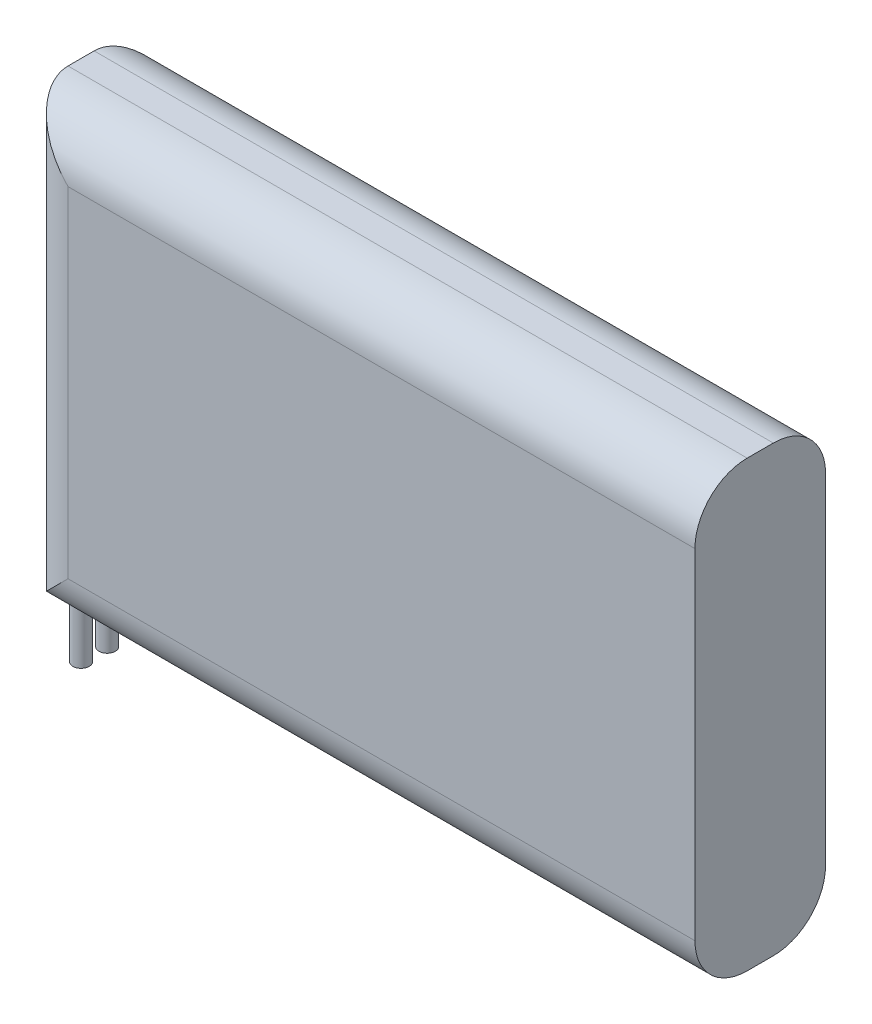
ISO-10303-21;
HEADER;
FILE_DESCRIPTION(('STEP AP214'),'2;1');
FILE_NAME('part.step','',(''),(''),'','','');
FILE_SCHEMA(('AUTOMOTIVE_DESIGN { 1 0 10303 214 1 1 1 1 }'));
ENDSEC;
DATA;
#1=APPLICATION_CONTEXT('core data for automotive mechanical design processes');
#2=APPLICATION_PROTOCOL_DEFINITION('international standard','automotive_design',2000,#1);
#3=PRODUCT_CONTEXT('',#1,'mechanical');
#4=PRODUCT('Part','Part','',(#3));
#5=PRODUCT_RELATED_PRODUCT_CATEGORY('part','',(#4));
#6=PRODUCT_DEFINITION_FORMATION('','',#4);
#7=PRODUCT_DEFINITION_CONTEXT('part definition',#1,'design');
#8=PRODUCT_DEFINITION('design','',#6,#7);
#9=PRODUCT_DEFINITION_SHAPE('','',#8);
#10=(LENGTH_UNIT() NAMED_UNIT(*) SI_UNIT(.MILLI.,.METRE.));
#11=(NAMED_UNIT(*) PLANE_ANGLE_UNIT() SI_UNIT($,.RADIAN.));
#12=(NAMED_UNIT(*) SI_UNIT($,.STERADIAN.) SOLID_ANGLE_UNIT());
#13=UNCERTAINTY_MEASURE_WITH_UNIT(LENGTH_MEASURE(1.E-05),#10,'distance_accuracy_value','');
#14=(GEOMETRIC_REPRESENTATION_CONTEXT(3) GLOBAL_UNCERTAINTY_ASSIGNED_CONTEXT((#13)) GLOBAL_UNIT_ASSIGNED_CONTEXT((#10,
#11,#12)) REPRESENTATION_CONTEXT('',''));
#15=CARTESIAN_POINT('',(0.,0.,0.));
#16=DIRECTION('',(0.,0.,1.));
#17=DIRECTION('',(1.,0.,0.));
#18=AXIS2_PLACEMENT_3D('',#15,#16,#17);
#19=CARTESIAN_POINT('',(26.,-17.,5.));
#20=DIRECTION('',(-1.,0.,0.));
#21=DIRECTION('',(0.,0.,1.));
#22=AXIS2_PLACEMENT_3D('',#19,#20,#21);
#23=PLANE('',#22);
#24=DIRECTION('',(0.,0.,-1.));
#25=VECTOR('',#24,1.);
#26=CARTESIAN_POINT('',(26.,-17.,5.));
#27=LINE('',#26,#25);
#28=CARTESIAN_POINT('',(26.,-17.,1.));
#29=VERTEX_POINT('',#28);
#30=CARTESIAN_POINT('',(26.,-17.,-1.));
#31=VERTEX_POINT('',#30);
#32=EDGE_CURVE('E152',#29,#31,#27,.T.);
#33=ORIENTED_EDGE('',*,*,#32,.T.);
#34=CARTESIAN_POINT('',(26.,-13.,-1.));
#35=DIRECTION('',(-1.,0.,0.));
#36=DIRECTION('',(0.,0.,1.));
#37=AXIS2_PLACEMENT_3D('',#34,#35,#36);
#38=CIRCLE('',#37,4.);
#39=CARTESIAN_POINT('',(26.,-13.,-5.));
#40=VERTEX_POINT('',#39);
#41=EDGE_CURVE('E160',#31,#40,#38,.F.);
#42=ORIENTED_EDGE('',*,*,#41,.T.);
#43=DIRECTION('',(0.,1.,0.));
#44=VECTOR('',#43,1.);
#45=CARTESIAN_POINT('',(26.,-17.,-5.));
#46=LINE('',#45,#44);
#47=CARTESIAN_POINT('',(26.,13.,-5.));
#48=VERTEX_POINT('',#47);
#49=EDGE_CURVE('E153',#40,#48,#46,.T.);
#50=ORIENTED_EDGE('',*,*,#49,.T.);
#51=CARTESIAN_POINT('',(26.,13.,-1.));
#52=DIRECTION('',(-1.,0.,0.));
#53=DIRECTION('',(0.,0.,1.));
#54=AXIS2_PLACEMENT_3D('',#51,#52,#53);
#55=CIRCLE('',#54,4.);
#56=CARTESIAN_POINT('',(26.,17.,-1.));
#57=VERTEX_POINT('',#56);
#58=EDGE_CURVE('E69',#48,#57,#55,.F.);
#59=ORIENTED_EDGE('',*,*,#58,.T.);
#60=DIRECTION('',(0.,0.,-1.));
#61=VECTOR('',#60,1.);
#62=CARTESIAN_POINT('',(26.,17.,5.));
#63=LINE('',#62,#61);
#64=CARTESIAN_POINT('',(26.,17.,1.));
#65=VERTEX_POINT('',#64);
#66=EDGE_CURVE('E265',#65,#57,#63,.T.);
#67=ORIENTED_EDGE('',*,*,#66,.F.);
#68=CARTESIAN_POINT('',(26.,13.,1.));
#69=DIRECTION('',(-1.,0.,0.));
#70=DIRECTION('',(0.,0.,1.));
#71=AXIS2_PLACEMENT_3D('',#68,#69,#70);
#72=CIRCLE('',#71,4.);
#73=CARTESIAN_POINT('',(26.,13.,5.));
#74=VERTEX_POINT('',#73);
#75=EDGE_CURVE('E150',#65,#74,#72,.F.);
#76=ORIENTED_EDGE('',*,*,#75,.T.);
#77=DIRECTION('',(0.,1.,0.));
#78=VECTOR('',#77,1.);
#79=CARTESIAN_POINT('',(26.,-17.,5.));
#80=LINE('',#79,#78);
#81=CARTESIAN_POINT('',(26.,-13.,5.));
#82=VERTEX_POINT('',#81);
#83=EDGE_CURVE('E136',#82,#74,#80,.T.);
#84=ORIENTED_EDGE('',*,*,#83,.F.);
#85=CARTESIAN_POINT('',(26.,-13.,1.));
#86=DIRECTION('',(-1.,0.,0.));
#87=DIRECTION('',(0.,0.,1.));
#88=AXIS2_PLACEMENT_3D('',#85,#86,#87);
#89=CIRCLE('',#88,4.);
#90=EDGE_CURVE('E147',#82,#29,#89,.F.);
#91=ORIENTED_EDGE('',*,*,#90,.T.);
#92=EDGE_LOOP('',(#33,#42,#50,#59,#67,#76,#84,#91));
#93=FACE_BOUND('',#92,.T.);
#94=ADVANCED_FACE('F51',(#93),#23,.F.);
#95=CARTESIAN_POINT('',(-26.,17.,5.));
#96=DIRECTION('',(0.,-1.,0.));
#97=DIRECTION('',(0.,0.,-1.));
#98=AXIS2_PLACEMENT_3D('',#95,#96,#97);
#99=PLANE('',#98);
#100=ORIENTED_EDGE('',*,*,#66,.T.);
#101=DIRECTION('',(-1.,0.,0.));
#102=VECTOR('',#101,1.);
#103=CARTESIAN_POINT('',(-26.,17.,-1.));
#104=LINE('',#103,#102);
#105=CARTESIAN_POINT('',(-26.,17.,-1.));
#106=VERTEX_POINT('',#105);
#107=EDGE_CURVE('E170',#57,#106,#104,.T.);
#108=ORIENTED_EDGE('',*,*,#107,.T.);
#109=DIRECTION('',(0.,0.,-1.));
#110=VECTOR('',#109,1.);
#111=CARTESIAN_POINT('',(-26.,17.,5.));
#112=LINE('',#111,#110);
#113=CARTESIAN_POINT('',(-26.,17.,1.));
#114=VERTEX_POINT('',#113);
#115=EDGE_CURVE('E261',#114,#106,#112,.T.);
#116=ORIENTED_EDGE('',*,*,#115,.F.);
#117=DIRECTION('',(-1.,0.,0.));
#118=VECTOR('',#117,1.);
#119=CARTESIAN_POINT('',(-26.,17.,1.));
#120=LINE('',#119,#118);
#121=EDGE_CURVE('E76',#114,#65,#120,.F.);
#122=ORIENTED_EDGE('',*,*,#121,.T.);
#123=EDGE_LOOP('',(#100,#108,#116,#122));
#124=FACE_BOUND('',#123,.T.);
#125=ADVANCED_FACE('F211',(#124),#99,.F.);
#126=CARTESIAN_POINT('',(-26.,-17.,5.));
#127=DIRECTION('',(1.,0.,0.));
#128=DIRECTION('',(0.,0.,-1.));
#129=AXIS2_PLACEMENT_3D('',#126,#127,#128);
#130=PLANE('',#129);
#131=DIRECTION('',(0.,0.,-1.));
#132=VECTOR('',#131,1.);
#133=CARTESIAN_POINT('',(-26.,-17.,5.));
#134=LINE('',#133,#132);
#135=CARTESIAN_POINT('',(-26.,-17.,1.));
#136=VERTEX_POINT('',#135);
#137=CARTESIAN_POINT('',(-26.,-17.,-1.));
#138=VERTEX_POINT('',#137);
#139=EDGE_CURVE('E257',#136,#138,#134,.T.);
#140=ORIENTED_EDGE('',*,*,#139,.F.);
#141=DIRECTION('',(0.,-1.,0.));
#142=VECTOR('',#141,1.);
#143=CARTESIAN_POINT('',(-26.,-17.,1.));
#144=LINE('',#143,#142);
#145=EDGE_CURVE('E284',#136,#114,#144,.F.);
#146=ORIENTED_EDGE('',*,*,#145,.T.);
#147=ORIENTED_EDGE('',*,*,#115,.T.);
#148=DIRECTION('',(0.,-1.,0.));
#149=VECTOR('',#148,1.);
#150=CARTESIAN_POINT('',(-26.,-17.,-1.));
#151=LINE('',#150,#149);
#152=EDGE_CURVE('E144',#106,#138,#151,.T.);
#153=ORIENTED_EDGE('',*,*,#152,.T.);
#154=EDGE_LOOP('',(#140,#146,#147,#153));
#155=FACE_BOUND('',#154,.T.);
#156=ADVANCED_FACE('F214',(#155),#130,.F.);
#157=CARTESIAN_POINT('',(-26.,-17.,5.));
#158=DIRECTION('',(0.,1.,0.));
#159=DIRECTION('',(0.,0.,1.));
#160=AXIS2_PLACEMENT_3D('',#157,#158,#159);
#161=PLANE('',#160);
#162=ORIENTED_EDGE('',*,*,#139,.T.);
#163=DIRECTION('',(1.,0.,0.));
#164=VECTOR('',#163,1.);
#165=CARTESIAN_POINT('',(26.,-17.,-1.));
#166=LINE('',#165,#164);
#167=CARTESIAN_POINT('',(-25.625,-17.,-1.));
#168=VERTEX_POINT('',#167);
#169=EDGE_CURVE('E304',#138,#168,#166,.T.);
#170=ORIENTED_EDGE('',*,*,#169,.T.);
#171=CARTESIAN_POINT('',(-25.,-17.,-1.));
#172=DIRECTION('',(0.,1.,0.));
#173=DIRECTION('',(0.,0.,1.));
#174=AXIS2_PLACEMENT_3D('',#171,#172,#173);
#175=CIRCLE('',#174,0.624999999999999);
#176=CARTESIAN_POINT('',(-24.375,-17.,-1.));
#177=VERTEX_POINT('',#176);
#178=EDGE_CURVE('E268',#177,#168,#175,.F.);
#179=ORIENTED_EDGE('',*,*,#178,.F.);
#180=DIRECTION('',(1.,0.,0.));
#181=VECTOR('',#180,1.);
#182=CARTESIAN_POINT('',(26.,-17.,-1.));
#183=LINE('',#182,#181);
#184=EDGE_CURVE('E301',#177,#31,#183,.T.);
#185=ORIENTED_EDGE('',*,*,#184,.T.);
#186=ORIENTED_EDGE('',*,*,#32,.F.);
#187=DIRECTION('',(1.,0.,0.));
#188=VECTOR('',#187,1.);
#189=CARTESIAN_POINT('',(-26.,-17.,1.));
#190=LINE('',#189,#188);
#191=CARTESIAN_POINT('',(-24.375,-17.,1.));
#192=VERTEX_POINT('',#191);
#193=EDGE_CURVE('E158',#29,#192,#190,.F.);
#194=ORIENTED_EDGE('',*,*,#193,.T.);
#195=CARTESIAN_POINT('',(-25.,-17.,1.));
#196=DIRECTION('',(0.,1.,0.));
#197=DIRECTION('',(0.,0.,1.));
#198=AXIS2_PLACEMENT_3D('',#195,#196,#197);
#199=CIRCLE('',#198,0.624999999999999);
#200=CARTESIAN_POINT('',(-25.625,-17.,1.));
#201=VERTEX_POINT('',#200);
#202=EDGE_CURVE('E272',#201,#192,#199,.F.);
#203=ORIENTED_EDGE('',*,*,#202,.F.);
#204=DIRECTION('',(1.,0.,0.));
#205=VECTOR('',#204,1.);
#206=CARTESIAN_POINT('',(-26.,-17.,1.));
#207=LINE('',#206,#205);
#208=EDGE_CURVE('E296',#201,#136,#207,.F.);
#209=ORIENTED_EDGE('',*,*,#208,.T.);
#210=EDGE_LOOP('',(#162,#170,#179,#185,#186,#194,#203,#209));
#211=FACE_BOUND('',#210,.T.);
#212=ADVANCED_FACE('F217',(#211),#161,.F.);
#213=CARTESIAN_POINT('',(0.,0.,5.));
#214=DIRECTION('',(0.,0.,-1.));
#215=DIRECTION('',(-1.,0.,0.));
#216=AXIS2_PLACEMENT_3D('',#213,#214,#215);
#217=PLANE('',#216);
#218=DIRECTION('',(0.,-1.,0.));
#219=VECTOR('',#218,1.);
#220=CARTESIAN_POINT('',(-22.,0.,5.));
#221=LINE('',#220,#219);
#222=CARTESIAN_POINT('',(-22.,13.,5.));
#223=VERTEX_POINT('',#222);
#224=CARTESIAN_POINT('',(-22.,-13.,5.));
#225=VERTEX_POINT('',#224);
#226=EDGE_CURVE('E139',#223,#225,#221,.T.);
#227=ORIENTED_EDGE('',*,*,#226,.T.);
#228=DIRECTION('',(1.,0.,0.));
#229=VECTOR('',#228,1.);
#230=CARTESIAN_POINT('',(0.,-13.,5.));
#231=LINE('',#230,#229);
#232=EDGE_CURVE('E133',#225,#82,#231,.T.);
#233=ORIENTED_EDGE('',*,*,#232,.T.);
#234=ORIENTED_EDGE('',*,*,#83,.T.);
#235=DIRECTION('',(-1.,0.,0.));
#236=VECTOR('',#235,1.);
#237=CARTESIAN_POINT('',(0.,13.,5.));
#238=LINE('',#237,#236);
#239=EDGE_CURVE('E276',#74,#223,#238,.T.);
#240=ORIENTED_EDGE('',*,*,#239,.T.);
#241=EDGE_LOOP('',(#227,#233,#234,#240));
#242=FACE_BOUND('',#241,.T.);
#243=ADVANCED_FACE('F135',(#242),#217,.F.);
#244=CARTESIAN_POINT('',(0.,0.,-5.));
#245=DIRECTION('',(0.,0.,-1.));
#246=DIRECTION('',(-1.,0.,0.));
#247=AXIS2_PLACEMENT_3D('',#244,#245,#246);
#248=PLANE('',#247);
#249=ORIENTED_EDGE('',*,*,#49,.F.);
#250=DIRECTION('',(1.,0.,0.));
#251=VECTOR('',#250,1.);
#252=CARTESIAN_POINT('',(-26.,-13.,-5.));
#253=LINE('',#252,#251);
#254=CARTESIAN_POINT('',(-22.,-13.,-5.));
#255=VERTEX_POINT('',#254);
#256=EDGE_CURVE('E293',#40,#255,#253,.F.);
#257=ORIENTED_EDGE('',*,*,#256,.T.);
#258=DIRECTION('',(0.,-1.,0.));
#259=VECTOR('',#258,1.);
#260=CARTESIAN_POINT('',(-22.,17.,-5.));
#261=LINE('',#260,#259);
#262=CARTESIAN_POINT('',(-22.,13.,-5.));
#263=VERTEX_POINT('',#262);
#264=EDGE_CURVE('E290',#255,#263,#261,.F.);
#265=ORIENTED_EDGE('',*,*,#264,.T.);
#266=DIRECTION('',(-1.,0.,0.));
#267=VECTOR('',#266,1.);
#268=CARTESIAN_POINT('',(26.,13.,-5.));
#269=LINE('',#268,#267);
#270=EDGE_CURVE('E287',#263,#48,#269,.F.);
#271=ORIENTED_EDGE('',*,*,#270,.T.);
#272=EDGE_LOOP('',(#249,#257,#265,#271));
#273=FACE_BOUND('',#272,.T.);
#274=ADVANCED_FACE('F222',(#273),#248,.T.);
#275=CARTESIAN_POINT('',(-25.,-22.,-1.));
#276=DIRECTION('',(0.,1.,0.));
#277=DIRECTION('',(0.,0.,1.));
#278=AXIS2_PLACEMENT_3D('',#275,#276,#277);
#279=CYLINDRICAL_SURFACE('',#278,0.624999999999999);
#280=CARTESIAN_POINT('',(-25.,-22.,-1.));
#281=DIRECTION('',(0.,-1.,0.));
#282=DIRECTION('',(0.,0.,-1.));
#283=AXIS2_PLACEMENT_3D('',#280,#281,#282);
#284=CIRCLE('',#283,0.624999999999999);
#285=CARTESIAN_POINT('',(-25.,-22.,-1.625));
#286=VERTEX_POINT('',#285);
#287=EDGE_CURVE('E240',#286,#286,#284,.T.);
#288=ORIENTED_EDGE('',*,*,#287,.F.);
#289=EDGE_LOOP('',(#288));
#290=FACE_BOUND('',#289,.T.);
#291=ORIENTED_EDGE('',*,*,#178,.T.);
#292=CARTESIAN_POINT('',(-25.625,-17.,-1.));
#293=CARTESIAN_POINT('',(-25.6250308655019,-17.000017368962,-1.0349363219005));
#294=CARTESIAN_POINT('',(-25.6220726469361,-16.9995428082822,-1.06985904974601));
#295=CARTESIAN_POINT('',(-25.6104113976975,-16.9977390417988,-1.13866698580614));
#296=CARTESIAN_POINT('',(-25.601715435193,-16.9964108875659,-1.17255341693393));
#297=CARTESIAN_POINT('',(-25.5788080515548,-16.9930281232149,-1.23837759775431));
#298=CARTESIAN_POINT('',(-25.5645952062425,-16.9909733255268,-1.27031484180027));
#299=CARTESIAN_POINT('',(-25.5310769147095,-16.9863694276969,-1.33135167996408));
#300=CARTESIAN_POINT('',(-25.5117715580788,-16.9838203362512,-1.36045132399007));
#301=CARTESIAN_POINT('',(-25.4684429677998,-16.9784858949165,-1.41522873433129));
#302=CARTESIAN_POINT('',(-25.4443856515681,-16.9756989261191,-1.44087938742411));
#303=CARTESIAN_POINT('',(-25.3923072094823,-16.9702154293288,-1.48779981245885));
#304=CARTESIAN_POINT('',(-25.3642854618611,-16.9675189156048,-1.5090688959235));
#305=CARTESIAN_POINT('',(-25.3048895793674,-16.9625060041086,-1.54672691673645));
#306=CARTESIAN_POINT('',(-25.2734983101829,-16.9601917172841,-1.56308913470013));
#307=CARTESIAN_POINT('',(-25.2083726874103,-16.9562279065361,-1.59029733207087));
#308=CARTESIAN_POINT('',(-25.1746386084534,-16.9545783048499,-1.60114395679597));
#309=CARTESIAN_POINT('',(-25.1060726863408,-16.9521466013685,-1.61692880411778));
#310=CARTESIAN_POINT('',(-25.0712519402121,-16.9513575852256,-1.62191414468571));
#311=CARTESIAN_POINT('',(-25.0012590466262,-16.9507154242014,-1.62598094577583));
#312=CARTESIAN_POINT('',(-24.9660869126879,-16.9508622434529,-1.62506263256398));
#313=CARTESIAN_POINT('',(-24.8967256357049,-16.952068877991,-1.61738644104511));
#314=CARTESIAN_POINT('',(-24.8625304842358,-16.9531204369934,-1.61068136862377));
#315=CARTESIAN_POINT('',(-24.7957567987818,-16.956005152012,-1.59170476696579));
#316=CARTESIAN_POINT('',(-24.7631783042175,-16.9578383270766,-1.57943310206709));
#317=CARTESIAN_POINT('',(-24.700402214455,-16.9620888084257,-1.54961701316045));
#318=CARTESIAN_POINT('',(-24.6702153855657,-16.9645085767808,-1.53205028681463));
#319=CARTESIAN_POINT('',(-24.6131990733347,-16.9696577208892,-1.49215924365022));
#320=CARTESIAN_POINT('',(-24.5863696992215,-16.9723871067097,-1.46983477211111));
#321=CARTESIAN_POINT('',(-24.5365259634274,-16.9778840786314,-1.42077632218555));
#322=CARTESIAN_POINT('',(-24.5135556912793,-16.980651760075,-1.39399754144435));
#323=CARTESIAN_POINT('',(-24.4724218099053,-16.985887113694,-1.33693225804762));
#324=CARTESIAN_POINT('',(-24.454259575235,-16.9883546999673,-1.30664475584424));
#325=CARTESIAN_POINT('',(-24.4232544957904,-16.9927150690655,-1.24337828299203));
#326=CARTESIAN_POINT('',(-24.4104183363078,-16.9946071286991,-1.21039599158943));
#327=CARTESIAN_POINT('',(-24.3904980141408,-16.9975954216003,-1.14273063024009));
#328=CARTESIAN_POINT('',(-24.3834052620537,-16.9986928430072,-1.10805018261246));
#329=CARTESIAN_POINT('',(-24.3778559021813,-16.9995546431177,-1.06092493514729));
#330=CARTESIAN_POINT('',(-24.3767844709786,-16.9997215219004,-1.04875438227657));
#331=CARTESIAN_POINT('',(-24.3753574609305,-16.999944081025,-1.0243909783464));
#332=CARTESIAN_POINT('',(-24.3750006761069,-16.9999999486987,-1.01219819966422));
#333=CARTESIAN_POINT('',(-24.375,-17.,-1.));
#334=B_SPLINE_CURVE_WITH_KNOTS('',3,(#292,#293,#294,#295,#296,#297,#298,#299,#300,#301,#302,
#303,#304,#305,#306,#307,#308,#309,#310,#311,#312,#313,#314,#315,#316,#317,#318,#319,#320,#321,
#322,#323,#324,#325,#326,#327,#328,#329,#330,#331,#332,#333),.UNSPECIFIED.,.F.,.F.,(4,2,2,2,2,2,
2,2,2,2,2,2,2,2,2,2,2,2,2,2,4),(0.,0.104660423346731,0.209192158517028,0.313750896432518,
0.418307795021119,0.523643781636771,0.628996307122004,0.734912506334447,0.840816310620932,
0.94586281946011,1.05090530226603,1.15499925624547,1.25909574720932,1.36363695990815,
1.46818157277613,1.5738495088923,1.6795476215544,1.78537800808539,1.89104982891409,
1.92769014262603,1.96426857290777),.UNSPECIFIED.);
#335=EDGE_CURVE('E61',#168,#177,#334,.T.);
#336=ORIENTED_EDGE('',*,*,#335,.T.);
#337=EDGE_LOOP('',(#291,#336));
#338=FACE_BOUND('',#337,.T.);
#339=ADVANCED_FACE('F186',(#290,#338),#279,.T.);
#340=CARTESIAN_POINT('',(-25.,-22.,-1.));
#341=DIRECTION('',(0.,-1.,0.));
#342=DIRECTION('',(0.,0.,-1.));
#343=AXIS2_PLACEMENT_3D('',#340,#341,#342);
#344=PLANE('',#343);
#345=ORIENTED_EDGE('',*,*,#287,.T.);
#346=EDGE_LOOP('',(#345));
#347=FACE_BOUND('',#346,.T.);
#348=ADVANCED_FACE('F227',(#347),#344,.T.);
#349=CARTESIAN_POINT('',(-25.,-22.,1.));
#350=DIRECTION('',(0.,1.,0.));
#351=DIRECTION('',(0.,0.,1.));
#352=AXIS2_PLACEMENT_3D('',#349,#350,#351);
#353=CYLINDRICAL_SURFACE('',#352,0.624999999999999);
#354=CARTESIAN_POINT('',(-25.,-22.,1.));
#355=DIRECTION('',(0.,-1.,0.));
#356=DIRECTION('',(0.,0.,-1.));
#357=AXIS2_PLACEMENT_3D('',#354,#355,#356);
#358=CIRCLE('',#357,0.624999999999999);
#359=CARTESIAN_POINT('',(-25.,-22.,0.375000000000001));
#360=VERTEX_POINT('',#359);
#361=EDGE_CURVE('E242',#360,#360,#358,.T.);
#362=ORIENTED_EDGE('',*,*,#361,.F.);
#363=EDGE_LOOP('',(#362));
#364=FACE_BOUND('',#363,.T.);
#365=ORIENTED_EDGE('',*,*,#202,.T.);
#366=CARTESIAN_POINT('',(-24.375,-17.,1.));
#367=CARTESIAN_POINT('',(-24.3749691344981,-17.000017368962,1.0349363219005));
#368=CARTESIAN_POINT('',(-24.3779273530639,-16.9995428082822,1.06985904974601));
#369=CARTESIAN_POINT('',(-24.3895886023025,-16.9977390417988,1.13866698580614));
#370=CARTESIAN_POINT('',(-24.398284564807,-16.9964108875659,1.17255341693393));
#371=CARTESIAN_POINT('',(-24.4211919484451,-16.9930281232149,1.23837759775431));
#372=CARTESIAN_POINT('',(-24.4354047937575,-16.9909733255268,1.27031484180027));
#373=CARTESIAN_POINT('',(-24.4689230852905,-16.9863694276969,1.33135167996407));
#374=CARTESIAN_POINT('',(-24.4882284419212,-16.9838203362512,1.36045132399007));
#375=CARTESIAN_POINT('',(-24.5315570322002,-16.9784858949165,1.41522873433129));
#376=CARTESIAN_POINT('',(-24.5556143484319,-16.9756989261191,1.44087938742411));
#377=CARTESIAN_POINT('',(-24.6076927905176,-16.9702154293288,1.48779981245885));
#378=CARTESIAN_POINT('',(-24.6357145381389,-16.9675189156048,1.5090688959235));
#379=CARTESIAN_POINT('',(-24.6951104206326,-16.9625060041086,1.54672691673645));
#380=CARTESIAN_POINT('',(-24.7265016898171,-16.9601917172841,1.56308913470013));
#381=CARTESIAN_POINT('',(-24.7916273125897,-16.9562279065361,1.59029733207087));
#382=CARTESIAN_POINT('',(-24.8253613915466,-16.9545783048499,1.60114395679597));
#383=CARTESIAN_POINT('',(-24.8939273136592,-16.9521466013685,1.61692880411778));
#384=CARTESIAN_POINT('',(-24.9287480597878,-16.9513575852256,1.62191414468571));
#385=CARTESIAN_POINT('',(-24.9987409533738,-16.9507154242014,1.62598094577583));
#386=CARTESIAN_POINT('',(-25.0339130873121,-16.9508622434529,1.62506263256398));
#387=CARTESIAN_POINT('',(-25.1032743642951,-16.952068877991,1.61738644104511));
#388=CARTESIAN_POINT('',(-25.1374695157642,-16.9531204369934,1.61068136862377));
#389=CARTESIAN_POINT('',(-25.2042432012182,-16.956005152012,1.59170476696579));
#390=CARTESIAN_POINT('',(-25.2368216957824,-16.9578383270766,1.57943310206709));
#391=CARTESIAN_POINT('',(-25.299597785545,-16.9620888084257,1.54961701316045));
#392=CARTESIAN_POINT('',(-25.3297846144343,-16.9645085767808,1.53205028681463));
#393=CARTESIAN_POINT('',(-25.3868009266653,-16.9696577208892,1.49215924365022));
#394=CARTESIAN_POINT('',(-25.4136303007785,-16.9723871067097,1.46983477211111));
#395=CARTESIAN_POINT('',(-25.4634740365725,-16.9778840786314,1.42077632218555));
#396=CARTESIAN_POINT('',(-25.4864443087207,-16.980651760075,1.39399754144435));
#397=CARTESIAN_POINT('',(-25.5275781900947,-16.985887113694,1.33693225804762));
#398=CARTESIAN_POINT('',(-25.545740424765,-16.9883546999673,1.30664475584424));
#399=CARTESIAN_POINT('',(-25.5767455042096,-16.9927150690655,1.24337828299203));
#400=CARTESIAN_POINT('',(-25.5895816636922,-16.9946071286991,1.21039599158943));
#401=CARTESIAN_POINT('',(-25.6095019858592,-16.9975954216003,1.14273063024009));
#402=CARTESIAN_POINT('',(-25.6165947379463,-16.9986928430072,1.10805018261246));
#403=CARTESIAN_POINT('',(-25.6221440978187,-16.9995546431177,1.06092493514729));
#404=CARTESIAN_POINT('',(-25.6232155290214,-16.9997215219004,1.04875438227657));
#405=CARTESIAN_POINT('',(-25.6246425390695,-16.999944081025,1.0243909783464));
#406=CARTESIAN_POINT('',(-25.624999323893,-16.9999999486987,1.01219819966422));
#407=CARTESIAN_POINT('',(-25.625,-17.,1.));
#408=B_SPLINE_CURVE_WITH_KNOTS('',3,(#366,#367,#368,#369,#370,#371,#372,#373,#374,#375,#376,
#377,#378,#379,#380,#381,#382,#383,#384,#385,#386,#387,#388,#389,#390,#391,#392,#393,#394,#395,
#396,#397,#398,#399,#400,#401,#402,#403,#404,#405,#406,#407),.UNSPECIFIED.,.F.,.F.,(4,2,2,2,2,2,
2,2,2,2,2,2,2,2,2,2,2,2,2,2,4),(0.,0.104660423346731,0.209192158517028,0.313750896432514,
0.418307795021119,0.523643781636771,0.628996307122005,0.734912506334448,0.840816310620933,
0.945862819460111,1.05090530226603,1.15499925624547,1.25909574720932,1.36363695990815,
1.46818157277613,1.5738495088923,1.6795476215544,1.78537800808539,1.89104982891409,
1.92769014262603,1.96426857290777),.UNSPECIFIED.);
#409=EDGE_CURVE('E11',#192,#201,#408,.T.);
#410=ORIENTED_EDGE('',*,*,#409,.T.);
#411=EDGE_LOOP('',(#365,#410));
#412=FACE_BOUND('',#411,.T.);
#413=ADVANCED_FACE('F229',(#364,#412),#353,.T.);
#414=CARTESIAN_POINT('',(-25.,-22.,1.));
#415=DIRECTION('',(0.,-1.,0.));
#416=DIRECTION('',(0.,0.,-1.));
#417=AXIS2_PLACEMENT_3D('',#414,#415,#416);
#418=PLANE('',#417);
#419=ORIENTED_EDGE('',*,*,#361,.T.);
#420=EDGE_LOOP('',(#419));
#421=FACE_BOUND('',#420,.T.);
#422=ADVANCED_FACE('F200',(#421),#418,.T.);
#423=CARTESIAN_POINT('',(0.,13.,1.));
#424=DIRECTION('',(-1.,0.,0.));
#425=DIRECTION('',(0.,0.,1.));
#426=AXIS2_PLACEMENT_3D('',#423,#424,#425);
#427=CYLINDRICAL_SURFACE('',#426,4.);
#428=ORIENTED_EDGE('',*,*,#75,.F.);
#429=ORIENTED_EDGE('',*,*,#121,.F.);
#430=CARTESIAN_POINT('',(-22.,13.,1.));
#431=DIRECTION('',(-0.707106781186547,-0.707106781186547,0.));
#432=DIRECTION('',(-0.707106781186547,0.707106781186547,0.));
#433=AXIS2_PLACEMENT_3D('',#430,#431,#432);
#434=ELLIPSE('',#433,5.65685424949238,4.);
#435=EDGE_CURVE('E243',#223,#114,#434,.T.);
#436=ORIENTED_EDGE('',*,*,#435,.F.);
#437=ORIENTED_EDGE('',*,*,#239,.F.);
#438=EDGE_LOOP('',(#428,#429,#436,#437));
#439=FACE_BOUND('',#438,.T.);
#440=ADVANCED_FACE('F198',(#439),#427,.T.);
#441=CARTESIAN_POINT('',(0.,-13.,1.));
#442=DIRECTION('',(1.,0.,0.));
#443=DIRECTION('',(0.,0.,-1.));
#444=AXIS2_PLACEMENT_3D('',#441,#442,#443);
#445=CYLINDRICAL_SURFACE('',#444,4.);
#446=ORIENTED_EDGE('',*,*,#90,.F.);
#447=ORIENTED_EDGE('',*,*,#232,.F.);
#448=CARTESIAN_POINT('',(-22.,-13.,1.));
#449=DIRECTION('',(0.707106781186547,-0.707106781186547,0.));
#450=DIRECTION('',(0.707106781186547,0.707106781186547,0.));
#451=AXIS2_PLACEMENT_3D('',#448,#449,#450);
#452=ELLIPSE('',#451,5.65685424949238,4.);
#453=EDGE_CURVE('E250',#136,#225,#452,.F.);
#454=ORIENTED_EDGE('',*,*,#453,.F.);
#455=ORIENTED_EDGE('',*,*,#208,.F.);
#456=ORIENTED_EDGE('',*,*,#409,.F.);
#457=ORIENTED_EDGE('',*,*,#193,.F.);
#458=EDGE_LOOP('',(#446,#447,#454,#455,#456,#457));
#459=FACE_BOUND('',#458,.T.);
#460=ADVANCED_FACE('F156',(#459),#445,.T.);
#461=CARTESIAN_POINT('',(-22.,0.,1.));
#462=DIRECTION('',(0.,-1.,0.));
#463=DIRECTION('',(0.,0.,-1.));
#464=AXIS2_PLACEMENT_3D('',#461,#462,#463);
#465=CYLINDRICAL_SURFACE('',#464,4.);
#466=ORIENTED_EDGE('',*,*,#435,.T.);
#467=ORIENTED_EDGE('',*,*,#145,.F.);
#468=ORIENTED_EDGE('',*,*,#453,.T.);
#469=ORIENTED_EDGE('',*,*,#226,.F.);
#470=EDGE_LOOP('',(#466,#467,#468,#469));
#471=FACE_BOUND('',#470,.T.);
#472=ADVANCED_FACE('F205',(#471),#465,.T.);
#473=CARTESIAN_POINT('',(-26.,13.,-1.));
#474=DIRECTION('',(1.,0.,0.));
#475=DIRECTION('',(0.,0.,-1.));
#476=AXIS2_PLACEMENT_3D('',#473,#474,#475);
#477=CYLINDRICAL_SURFACE('',#476,4.);
#478=ORIENTED_EDGE('',*,*,#58,.F.);
#479=ORIENTED_EDGE('',*,*,#270,.F.);
#480=CARTESIAN_POINT('',(-22.,13.,-1.));
#481=DIRECTION('',(0.707106781186547,0.707106781186547,0.));
#482=DIRECTION('',(0.707106781186547,-0.707106781186547,0.));
#483=AXIS2_PLACEMENT_3D('',#480,#481,#482);
#484=ELLIPSE('',#483,5.65685424949238,4.);
#485=EDGE_CURVE('E55',#106,#263,#484,.F.);
#486=ORIENTED_EDGE('',*,*,#485,.F.);
#487=ORIENTED_EDGE('',*,*,#107,.F.);
#488=EDGE_LOOP('',(#478,#479,#486,#487));
#489=FACE_BOUND('',#488,.T.);
#490=ADVANCED_FACE('F53',(#489),#477,.T.);
#491=CARTESIAN_POINT('',(-26.,-13.,-1.));
#492=DIRECTION('',(-1.,0.,0.));
#493=DIRECTION('',(0.,0.,1.));
#494=AXIS2_PLACEMENT_3D('',#491,#492,#493);
#495=CYLINDRICAL_SURFACE('',#494,4.);
#496=ORIENTED_EDGE('',*,*,#335,.F.);
#497=ORIENTED_EDGE('',*,*,#169,.F.);
#498=CARTESIAN_POINT('',(-22.,-13.,-1.));
#499=DIRECTION('',(-0.707106781186547,0.707106781186547,0.));
#500=DIRECTION('',(-0.707106781186547,-0.707106781186547,0.));
#501=AXIS2_PLACEMENT_3D('',#498,#499,#500);
#502=ELLIPSE('',#501,5.65685424949238,4.);
#503=EDGE_CURVE('E319',#255,#138,#502,.T.);
#504=ORIENTED_EDGE('',*,*,#503,.F.);
#505=ORIENTED_EDGE('',*,*,#256,.F.);
#506=ORIENTED_EDGE('',*,*,#41,.F.);
#507=ORIENTED_EDGE('',*,*,#184,.F.);
#508=EDGE_LOOP('',(#496,#497,#504,#505,#506,#507));
#509=FACE_BOUND('',#508,.T.);
#510=ADVANCED_FACE('F189',(#509),#495,.T.);
#511=CARTESIAN_POINT('',(-22.,-17.,-1.));
#512=DIRECTION('',(0.,1.,0.));
#513=DIRECTION('',(0.,0.,1.));
#514=AXIS2_PLACEMENT_3D('',#511,#512,#513);
#515=CYLINDRICAL_SURFACE('',#514,4.);
#516=ORIENTED_EDGE('',*,*,#485,.T.);
#517=ORIENTED_EDGE('',*,*,#264,.F.);
#518=ORIENTED_EDGE('',*,*,#503,.T.);
#519=ORIENTED_EDGE('',*,*,#152,.F.);
#520=EDGE_LOOP('',(#516,#517,#518,#519));
#521=FACE_BOUND('',#520,.T.);
#522=ADVANCED_FACE('F193',(#521),#515,.T.);
#523=CLOSED_SHELL('',(#94,#125,#156,#212,#243,#274,#339,#348,#413,#422,#440,#460,#472,#490,#510,#522));
#524=MANIFOLD_SOLID_BREP('B2',#523);
#525=ADVANCED_BREP_SHAPE_REPRESENTATION('',(#18,#524),#14);
#526=SHAPE_DEFINITION_REPRESENTATION(#9,#525);
ENDSEC;
END-ISO-10303-21;
